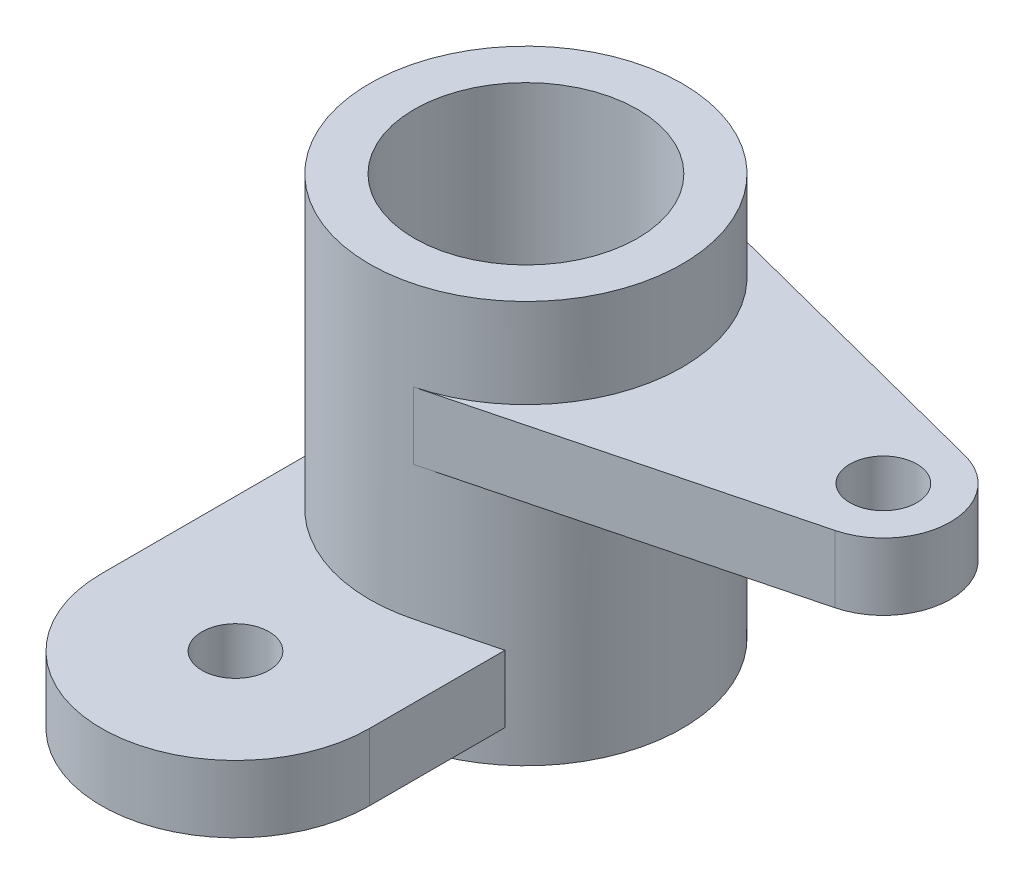
ISO-10303-21;
HEADER;
FILE_DESCRIPTION(('STEP AP214'),'2;1');
FILE_NAME('part.step','',(''),(''),'','','');
FILE_SCHEMA(('AUTOMOTIVE_DESIGN { 1 0 10303 214 1 1 1 1 }'));
ENDSEC;
DATA;
#1=APPLICATION_CONTEXT('core data for automotive mechanical design processes');
#2=APPLICATION_PROTOCOL_DEFINITION('international standard','automotive_design',2000,#1);
#3=PRODUCT_CONTEXT('',#1,'mechanical');
#4=PRODUCT('Part','Part','',(#3));
#5=PRODUCT_RELATED_PRODUCT_CATEGORY('part','',(#4));
#6=PRODUCT_DEFINITION_FORMATION('','',#4);
#7=PRODUCT_DEFINITION_CONTEXT('part definition',#1,'design');
#8=PRODUCT_DEFINITION('design','',#6,#7);
#9=PRODUCT_DEFINITION_SHAPE('','',#8);
#10=(LENGTH_UNIT() NAMED_UNIT(*) SI_UNIT(.MILLI.,.METRE.));
#11=(NAMED_UNIT(*) PLANE_ANGLE_UNIT() SI_UNIT($,.RADIAN.));
#12=(NAMED_UNIT(*) SI_UNIT($,.STERADIAN.) SOLID_ANGLE_UNIT());
#13=UNCERTAINTY_MEASURE_WITH_UNIT(LENGTH_MEASURE(1.E-05),#10,'distance_accuracy_value','');
#14=(GEOMETRIC_REPRESENTATION_CONTEXT(3) GLOBAL_UNCERTAINTY_ASSIGNED_CONTEXT((#13)) GLOBAL_UNIT_ASSIGNED_CONTEXT((#10,
#11,#12)) REPRESENTATION_CONTEXT('',''));
#15=CARTESIAN_POINT('',(0.,0.,0.));
#16=DIRECTION('',(0.,0.,1.));
#17=DIRECTION('',(1.,0.,0.));
#18=AXIS2_PLACEMENT_3D('',#15,#16,#17);
#19=CARTESIAN_POINT('',(0.,-90.,0.));
#20=DIRECTION('',(0.,1.,0.));
#21=DIRECTION('',(0.,0.,1.));
#22=AXIS2_PLACEMENT_3D('',#19,#20,#21);
#23=CYLINDRICAL_SURFACE('',#22,35.);
#24=CARTESIAN_POINT('',(0.,-90.,0.));
#25=DIRECTION('',(0.,1.,0.));
#26=DIRECTION('',(0.,0.,1.));
#27=AXIS2_PLACEMENT_3D('',#24,#25,#26);
#28=CIRCLE('',#27,35.);
#29=CARTESIAN_POINT('',(0.,-90.,35.));
#30=VERTEX_POINT('',#29);
#31=EDGE_CURVE('E11',#30,#30,#28,.T.);
#32=ORIENTED_EDGE('',*,*,#31,.T.);
#33=EDGE_LOOP('',(#32));
#34=FACE_BOUND('',#33,.T.);
#35=CARTESIAN_POINT('',(0.,0.,0.));
#36=DIRECTION('',(0.,1.,0.));
#37=DIRECTION('',(0.,0.,1.));
#38=AXIS2_PLACEMENT_3D('',#35,#36,#37);
#39=CIRCLE('',#38,35.);
#40=CARTESIAN_POINT('',(0.,0.,35.));
#41=VERTEX_POINT('',#40);
#42=EDGE_CURVE('E49',#41,#41,#39,.T.);
#43=ORIENTED_EDGE('',*,*,#42,.F.);
#44=EDGE_LOOP('',(#43));
#45=FACE_BOUND('',#44,.T.);
#46=DIRECTION('',(0.,1.,0.));
#47=VECTOR('',#46,1.);
#48=CARTESIAN_POINT('',(8.75000000000001,-35.,-33.8886042793149));
#49=LINE('',#48,#47);
#50=CARTESIAN_POINT('',(8.75000000000002,-35.,-33.8886042793149));
#51=VERTEX_POINT('',#50);
#52=CARTESIAN_POINT('',(8.75000000000002,-20.,-33.8886042793149));
#53=VERTEX_POINT('',#52);
#54=EDGE_CURVE('E231',#51,#53,#49,.T.);
#55=ORIENTED_EDGE('',*,*,#54,.F.);
#56=CARTESIAN_POINT('',(0.,-35.,0.));
#57=DIRECTION('',(0.,1.,0.));
#58=DIRECTION('',(0.,0.,1.));
#59=AXIS2_PLACEMENT_3D('',#56,#57,#58);
#60=CIRCLE('',#59,35.);
#61=CARTESIAN_POINT('',(8.75000000000001,-35.,33.8886042793149));
#62=VERTEX_POINT('',#61);
#63=EDGE_CURVE('E198',#62,#51,#60,.T.);
#64=ORIENTED_EDGE('',*,*,#63,.F.);
#65=DIRECTION('',(0.,1.,0.));
#66=VECTOR('',#65,1.);
#67=CARTESIAN_POINT('',(8.75000000000001,-35.,33.8886042793149));
#68=LINE('',#67,#66);
#69=CARTESIAN_POINT('',(8.75000000000001,-20.,33.8886042793149));
#70=VERTEX_POINT('',#69);
#71=EDGE_CURVE('E228',#62,#70,#68,.T.);
#72=ORIENTED_EDGE('',*,*,#71,.T.);
#73=CARTESIAN_POINT('',(0.,-20.,0.));
#74=DIRECTION('',(0.,1.,0.));
#75=DIRECTION('',(0.,0.,1.));
#76=AXIS2_PLACEMENT_3D('',#73,#74,#75);
#77=CIRCLE('',#76,35.);
#78=EDGE_CURVE('E218',#70,#53,#77,.T.);
#79=ORIENTED_EDGE('',*,*,#78,.T.);
#80=EDGE_LOOP('',(#55,#64,#72,#79));
#81=FACE_BOUND('',#80,.T.);
#82=DIRECTION('',(0.,1.,0.));
#83=VECTOR('',#82,1.);
#84=CARTESIAN_POINT('',(8.75000000000001,-80.,33.8886042793149));
#85=LINE('',#84,#83);
#86=CARTESIAN_POINT('',(8.75000000000001,-80.,33.8886042793149));
#87=VERTEX_POINT('',#86);
#88=CARTESIAN_POINT('',(8.75000000000001,-65.,33.8886042793149));
#89=VERTEX_POINT('',#88);
#90=EDGE_CURVE('E68',#87,#89,#85,.T.);
#91=ORIENTED_EDGE('',*,*,#90,.F.);
#92=CARTESIAN_POINT('',(0.,-80.,0.));
#93=DIRECTION('',(0.,1.,0.));
#94=DIRECTION('',(0.,0.,1.));
#95=AXIS2_PLACEMENT_3D('',#92,#93,#94);
#96=CIRCLE('',#95,35.);
#97=CARTESIAN_POINT('',(-35.,-80.,0.));
#98=VERTEX_POINT('',#97);
#99=EDGE_CURVE('E63',#98,#87,#96,.T.);
#100=ORIENTED_EDGE('',*,*,#99,.F.);
#101=DIRECTION('',(0.,1.,0.));
#102=VECTOR('',#101,1.);
#103=CARTESIAN_POINT('',(-35.,-80.,0.));
#104=LINE('',#103,#102);
#105=CARTESIAN_POINT('',(-35.,-65.,0.));
#106=VERTEX_POINT('',#105);
#107=EDGE_CURVE('E133',#98,#106,#104,.T.);
#108=ORIENTED_EDGE('',*,*,#107,.T.);
#109=CARTESIAN_POINT('',(0.,-65.,0.));
#110=DIRECTION('',(0.,1.,0.));
#111=DIRECTION('',(0.,0.,1.));
#112=AXIS2_PLACEMENT_3D('',#109,#110,#111);
#113=CIRCLE('',#112,35.);
#114=EDGE_CURVE('E172',#106,#89,#113,.T.);
#115=ORIENTED_EDGE('',*,*,#114,.T.);
#116=EDGE_LOOP('',(#91,#100,#108,#115));
#117=FACE_BOUND('',#116,.T.);
#118=ADVANCED_FACE('F45',(#34,#45,#81,#117),#23,.T.);
#119=CARTESIAN_POINT('',(0.,-90.,0.));
#120=DIRECTION('',(0.,1.,0.));
#121=DIRECTION('',(0.,0.,1.));
#122=AXIS2_PLACEMENT_3D('',#119,#120,#121);
#123=CYLINDRICAL_SURFACE('',#122,25.);
#124=CARTESIAN_POINT('',(0.,-90.,0.));
#125=DIRECTION('',(0.,1.,0.));
#126=DIRECTION('',(0.,0.,1.));
#127=AXIS2_PLACEMENT_3D('',#124,#125,#126);
#128=CIRCLE('',#127,25.);
#129=CARTESIAN_POINT('',(0.,-90.,25.));
#130=VERTEX_POINT('',#129);
#131=EDGE_CURVE('E55',#130,#130,#128,.T.);
#132=CARTESIAN_POINT('',(0.,0.,0.));
#133=DIRECTION('',(0.,1.,0.));
#134=DIRECTION('',(0.,0.,1.));
#135=AXIS2_PLACEMENT_3D('',#132,#133,#134);
#136=CIRCLE('',#135,25.);
#137=CARTESIAN_POINT('',(0.,0.,25.));
#138=VERTEX_POINT('',#137);
#139=EDGE_CURVE('E227',#138,#138,#136,.T.);
#140=CARTESIAN_POINT('',(0.,-90.,25.));
#141=CARTESIAN_POINT('',(0.,-89.0625,25.));
#142=CARTESIAN_POINT('',(0.,-88.125,25.));
#143=CARTESIAN_POINT('',(0.,-86.25,25.));
#144=CARTESIAN_POINT('',(0.,-85.3125,25.));
#145=CARTESIAN_POINT('',(0.,-83.4375,25.));
#146=CARTESIAN_POINT('',(0.,-82.5,25.));
#147=CARTESIAN_POINT('',(0.,-80.625,25.));
#148=CARTESIAN_POINT('',(0.,-79.6875,25.));
#149=CARTESIAN_POINT('',(0.,-77.8125,25.));
#150=CARTESIAN_POINT('',(0.,-76.875,25.));
#151=CARTESIAN_POINT('',(0.,-75.,25.));
#152=CARTESIAN_POINT('',(0.,-74.0625,25.));
#153=CARTESIAN_POINT('',(0.,-72.1875,25.));
#154=CARTESIAN_POINT('',(0.,-71.25,25.));
#155=CARTESIAN_POINT('',(0.,-69.375,25.));
#156=CARTESIAN_POINT('',(0.,-68.4375,25.));
#157=CARTESIAN_POINT('',(0.,-66.5625,25.));
#158=CARTESIAN_POINT('',(0.,-65.625,25.));
#159=CARTESIAN_POINT('',(0.,-63.75,25.));
#160=CARTESIAN_POINT('',(0.,-62.8125,25.));
#161=CARTESIAN_POINT('',(0.,-60.9375,25.));
#162=CARTESIAN_POINT('',(0.,-60.,25.));
#163=CARTESIAN_POINT('',(0.,-58.125,25.));
#164=CARTESIAN_POINT('',(0.,-57.1875,25.));
#165=CARTESIAN_POINT('',(0.,-55.3125,25.));
#166=CARTESIAN_POINT('',(0.,-54.375,25.));
#167=CARTESIAN_POINT('',(0.,-52.5,25.));
#168=CARTESIAN_POINT('',(0.,-51.5625,25.));
#169=CARTESIAN_POINT('',(0.,-49.6875,25.));
#170=CARTESIAN_POINT('',(0.,-48.75,25.));
#171=CARTESIAN_POINT('',(0.,-46.875,25.));
#172=CARTESIAN_POINT('',(0.,-45.9375,25.));
#173=CARTESIAN_POINT('',(0.,-44.0625,25.));
#174=CARTESIAN_POINT('',(0.,-43.125,25.));
#175=CARTESIAN_POINT('',(0.,-41.25,25.));
#176=CARTESIAN_POINT('',(0.,-40.3125,25.));
#177=CARTESIAN_POINT('',(0.,-38.4375,25.));
#178=CARTESIAN_POINT('',(0.,-37.5,25.));
#179=CARTESIAN_POINT('',(0.,-35.625,25.));
#180=CARTESIAN_POINT('',(0.,-34.6875,25.));
#181=CARTESIAN_POINT('',(0.,-32.8125,25.));
#182=CARTESIAN_POINT('',(0.,-31.875,25.));
#183=CARTESIAN_POINT('',(0.,-30.,25.));
#184=CARTESIAN_POINT('',(0.,-29.0625,25.));
#185=CARTESIAN_POINT('',(0.,-27.1875,25.));
#186=CARTESIAN_POINT('',(0.,-26.25,25.));
#187=CARTESIAN_POINT('',(0.,-24.375,25.));
#188=CARTESIAN_POINT('',(0.,-23.4375,25.));
#189=CARTESIAN_POINT('',(0.,-21.5625,25.));
#190=CARTESIAN_POINT('',(0.,-20.625,25.));
#191=CARTESIAN_POINT('',(0.,-18.75,25.));
#192=CARTESIAN_POINT('',(0.,-17.8125,25.));
#193=CARTESIAN_POINT('',(0.,-15.9375,25.));
#194=CARTESIAN_POINT('',(0.,-15.,25.));
#195=CARTESIAN_POINT('',(0.,-13.125,25.));
#196=CARTESIAN_POINT('',(0.,-12.1875,25.));
#197=CARTESIAN_POINT('',(0.,-10.3125,25.));
#198=CARTESIAN_POINT('',(0.,-9.37500000000001,25.));
#199=CARTESIAN_POINT('',(0.,-7.50000000000002,25.));
#200=CARTESIAN_POINT('',(0.,-6.56250000000002,25.));
#201=CARTESIAN_POINT('',(0.,-4.68750000000002,25.));
#202=CARTESIAN_POINT('',(0.,-3.75000000000001,25.));
#203=CARTESIAN_POINT('',(0.,-1.87500000000001,25.));
#204=CARTESIAN_POINT('',(0.,-0.937500000000014,25.));
#205=CARTESIAN_POINT('',(0.,0.,25.));
#206=B_SPLINE_CURVE_WITH_KNOTS('',3,(#140,#141,#142,#143,#144,#145,#146,#147,#148,#149,#150,
#151,#152,#153,#154,#155,#156,#157,#158,#159,#160,#161,#162,#163,#164,#165,#166,#167,#168,#169,
#170,#171,#172,#173,#174,#175,#176,#177,#178,#179,#180,#181,#182,#183,#184,#185,#186,#187,#188,
#189,#190,#191,#192,#193,#194,#195,#196,#197,#198,#199,#200,#201,#202,#203,#204,#205),
.UNSPECIFIED.,.F.,.F.,(4,2,2,2,2,2,2,2,2,2,2,2,2,2,2,2,2,2,2,2,2,2,2,2,2,2,2,2,2,2,2,2,4),(0.,
2.81250000000001,5.62500000000001,8.4375,11.25,14.0625,16.875,19.6875,22.5,25.3125,28.125,
30.9375,33.75,36.5625,39.375,42.1875,45.,47.8125,50.625,53.4375,56.25,59.0625,61.875,64.6875,
67.5,70.3125,73.125,75.9375,78.75,81.5625,84.375,87.1875,90.),.UNSPECIFIED.);
#207=EDGE_CURVE('BSEAM47',#130,#138,#206,.T.);
#208=ORIENTED_EDGE('',*,*,#131,.F.);
#209=ORIENTED_EDGE('',*,*,#139,.T.);
#210=ORIENTED_EDGE('',*,*,#207,.T.);
#211=ORIENTED_EDGE('',*,*,#207,.F.);
#212=EDGE_LOOP('',(#208,#210,#209,#211));
#213=FACE_BOUND('',#212,.T.);
#214=ADVANCED_FACE('F47',(#213),#123,.F.);
#215=CARTESIAN_POINT('',(0.,-90.,0.));
#216=DIRECTION('',(0.,1.,0.));
#217=DIRECTION('',(0.,0.,1.));
#218=AXIS2_PLACEMENT_3D('',#215,#216,#217);
#219=PLANE('',#218);
#220=ORIENTED_EDGE('',*,*,#131,.T.);
#221=EDGE_LOOP('',(#220));
#222=FACE_BOUND('',#221,.T.);
#223=ORIENTED_EDGE('',*,*,#31,.F.);
#224=EDGE_LOOP('',(#223));
#225=FACE_BOUND('',#224,.T.);
#226=ADVANCED_FACE('F294',(#222,#225),#219,.F.);
#227=CARTESIAN_POINT('',(0.,0.,0.));
#228=DIRECTION('',(0.,1.,0.));
#229=DIRECTION('',(0.,0.,1.));
#230=AXIS2_PLACEMENT_3D('',#227,#228,#229);
#231=PLANE('',#230);
#232=ORIENTED_EDGE('',*,*,#139,.F.);
#233=EDGE_LOOP('',(#232));
#234=FACE_BOUND('',#233,.T.);
#235=ORIENTED_EDGE('',*,*,#42,.T.);
#236=EDGE_LOOP('',(#235));
#237=FACE_BOUND('',#236,.T.);
#238=ADVANCED_FACE('F247',(#234,#237),#231,.T.);
#239=CARTESIAN_POINT('',(80.,-35.,0.));
#240=DIRECTION('',(0.,1.,0.));
#241=DIRECTION('',(0.,0.,1.));
#242=AXIS2_PLACEMENT_3D('',#239,#240,#241);
#243=CYLINDRICAL_SURFACE('',#242,15.);
#244=CARTESIAN_POINT('',(80.,-20.,0.));
#245=DIRECTION('',(0.,1.,0.));
#246=DIRECTION('',(0.,0.,1.));
#247=AXIS2_PLACEMENT_3D('',#244,#245,#246);
#248=CIRCLE('',#247,15.);
#249=CARTESIAN_POINT('',(83.75,-20.,14.5236875482778));
#250=VERTEX_POINT('',#249);
#251=CARTESIAN_POINT('',(83.75,-20.,-14.5236875482778));
#252=VERTEX_POINT('',#251);
#253=EDGE_CURVE('E210',#250,#252,#248,.T.);
#254=ORIENTED_EDGE('',*,*,#253,.F.);
#255=DIRECTION('',(0.,1.,0.));
#256=VECTOR('',#255,1.);
#257=CARTESIAN_POINT('',(83.75,-35.,14.5236875482778));
#258=LINE('',#257,#256);
#259=CARTESIAN_POINT('',(83.75,-35.,14.5236875482778));
#260=VERTEX_POINT('',#259);
#261=EDGE_CURVE('E224',#260,#250,#258,.T.);
#262=ORIENTED_EDGE('',*,*,#261,.F.);
#263=CARTESIAN_POINT('',(80.,-35.,0.));
#264=DIRECTION('',(0.,1.,0.));
#265=DIRECTION('',(0.,0.,1.));
#266=AXIS2_PLACEMENT_3D('',#263,#264,#265);
#267=CIRCLE('',#266,15.);
#268=CARTESIAN_POINT('',(83.75,-35.,-14.5236875482778));
#269=VERTEX_POINT('',#268);
#270=EDGE_CURVE('E189',#260,#269,#267,.T.);
#271=ORIENTED_EDGE('',*,*,#270,.T.);
#272=DIRECTION('',(0.,1.,0.));
#273=VECTOR('',#272,1.);
#274=CARTESIAN_POINT('',(83.75,-35.,-14.5236875482778));
#275=LINE('',#274,#273);
#276=EDGE_CURVE('E206',#269,#252,#275,.T.);
#277=ORIENTED_EDGE('',*,*,#276,.T.);
#278=EDGE_LOOP('',(#254,#262,#271,#277));
#279=FACE_BOUND('',#278,.T.);
#280=ADVANCED_FACE('F264',(#279),#243,.T.);
#281=CARTESIAN_POINT('',(8.75000000000001,-35.,33.8886042793149));
#282=DIRECTION('',(-0.25,0.,-0.968245836551854));
#283=DIRECTION('',(-0.968245836551854,0.,0.25));
#284=AXIS2_PLACEMENT_3D('',#281,#282,#283);
#285=PLANE('',#284);
#286=DIRECTION('',(-0.968245836551854,0.,0.25));
#287=VECTOR('',#286,1.);
#288=CARTESIAN_POINT('',(8.75000000000001,-20.,33.8886042793149));
#289=LINE('',#288,#287);
#290=EDGE_CURVE('E190',#250,#70,#289,.T.);
#291=ORIENTED_EDGE('',*,*,#290,.T.);
#292=ORIENTED_EDGE('',*,*,#71,.F.);
#293=DIRECTION('',(-0.968245836551854,0.,0.25));
#294=VECTOR('',#293,1.);
#295=CARTESIAN_POINT('',(8.75000000000001,-35.,33.8886042793149));
#296=LINE('',#295,#294);
#297=EDGE_CURVE('E202',#260,#62,#296,.T.);
#298=ORIENTED_EDGE('',*,*,#297,.F.);
#299=ORIENTED_EDGE('',*,*,#261,.T.);
#300=EDGE_LOOP('',(#291,#292,#298,#299));
#301=FACE_BOUND('',#300,.T.);
#302=ADVANCED_FACE('F267',(#301),#285,.F.);
#303=CARTESIAN_POINT('',(80.,-35.,0.));
#304=DIRECTION('',(0.,1.,0.));
#305=DIRECTION('',(0.,0.,1.));
#306=AXIS2_PLACEMENT_3D('',#303,#304,#305);
#307=CYLINDRICAL_SURFACE('',#306,7.50000000000001);
#308=CARTESIAN_POINT('',(80.,-35.,0.));
#309=DIRECTION('',(0.,1.,0.));
#310=DIRECTION('',(0.,0.,1.));
#311=AXIS2_PLACEMENT_3D('',#308,#309,#310);
#312=CIRCLE('',#311,7.50000000000001);
#313=CARTESIAN_POINT('',(80.,-35.,7.50000000000001));
#314=VERTEX_POINT('',#313);
#315=EDGE_CURVE('E185',#314,#314,#312,.T.);
#316=ORIENTED_EDGE('',*,*,#315,.F.);
#317=EDGE_LOOP('',(#316));
#318=FACE_BOUND('',#317,.T.);
#319=CARTESIAN_POINT('',(80.,-20.,0.));
#320=DIRECTION('',(0.,1.,0.));
#321=DIRECTION('',(0.,0.,1.));
#322=AXIS2_PLACEMENT_3D('',#319,#320,#321);
#323=CIRCLE('',#322,7.50000000000001);
#324=CARTESIAN_POINT('',(80.,-20.,7.50000000000001));
#325=VERTEX_POINT('',#324);
#326=EDGE_CURVE('E177',#325,#325,#323,.T.);
#327=ORIENTED_EDGE('',*,*,#326,.T.);
#328=EDGE_LOOP('',(#327));
#329=FACE_BOUND('',#328,.T.);
#330=ADVANCED_FACE('F286',(#318,#329),#307,.F.);
#331=CARTESIAN_POINT('',(8.75000000000002,-35.,-33.8886042793149));
#332=DIRECTION('',(0.25,0.,-0.968245836551854));
#333=DIRECTION('',(-0.968245836551854,0.,-0.25));
#334=AXIS2_PLACEMENT_3D('',#331,#332,#333);
#335=PLANE('',#334);
#336=DIRECTION('',(-0.968245836551854,0.,-0.25));
#337=VECTOR('',#336,1.);
#338=CARTESIAN_POINT('',(8.75000000000002,-20.,-33.8886042793149));
#339=LINE('',#338,#337);
#340=EDGE_CURVE('E214',#252,#53,#339,.T.);
#341=ORIENTED_EDGE('',*,*,#340,.F.);
#342=ORIENTED_EDGE('',*,*,#276,.F.);
#343=DIRECTION('',(-0.968245836551854,0.,-0.25));
#344=VECTOR('',#343,1.);
#345=CARTESIAN_POINT('',(8.75000000000002,-35.,-33.8886042793149));
#346=LINE('',#345,#344);
#347=EDGE_CURVE('E194',#269,#51,#346,.T.);
#348=ORIENTED_EDGE('',*,*,#347,.T.);
#349=ORIENTED_EDGE('',*,*,#54,.T.);
#350=EDGE_LOOP('',(#341,#342,#348,#349));
#351=FACE_BOUND('',#350,.T.);
#352=ADVANCED_FACE('F261',(#351),#335,.T.);
#353=CARTESIAN_POINT('',(0.,-35.,0.));
#354=DIRECTION('',(0.,1.,0.));
#355=DIRECTION('',(0.,0.,1.));
#356=AXIS2_PLACEMENT_3D('',#353,#354,#355);
#357=PLANE('',#356);
#358=ORIENTED_EDGE('',*,*,#315,.T.);
#359=EDGE_LOOP('',(#358));
#360=FACE_BOUND('',#359,.T.);
#361=ORIENTED_EDGE('',*,*,#270,.F.);
#362=ORIENTED_EDGE('',*,*,#297,.T.);
#363=ORIENTED_EDGE('',*,*,#63,.T.);
#364=ORIENTED_EDGE('',*,*,#347,.F.);
#365=EDGE_LOOP('',(#361,#362,#363,#364));
#366=FACE_BOUND('',#365,.T.);
#367=ADVANCED_FACE('F258',(#360,#366),#357,.F.);
#368=CARTESIAN_POINT('',(0.,-20.,0.));
#369=DIRECTION('',(0.,1.,0.));
#370=DIRECTION('',(0.,0.,1.));
#371=AXIS2_PLACEMENT_3D('',#368,#369,#370);
#372=PLANE('',#371);
#373=ORIENTED_EDGE('',*,*,#326,.F.);
#374=EDGE_LOOP('',(#373));
#375=FACE_BOUND('',#374,.T.);
#376=ORIENTED_EDGE('',*,*,#253,.T.);
#377=ORIENTED_EDGE('',*,*,#340,.T.);
#378=ORIENTED_EDGE('',*,*,#78,.F.);
#379=ORIENTED_EDGE('',*,*,#290,.F.);
#380=EDGE_LOOP('',(#376,#377,#378,#379));
#381=FACE_BOUND('',#380,.T.);
#382=ADVANCED_FACE('F269',(#375,#381),#372,.T.);
#383=CARTESIAN_POINT('',(-35.,-80.,0.));
#384=DIRECTION('',(1.,0.,0.));
#385=DIRECTION('',(0.,0.,-1.));
#386=AXIS2_PLACEMENT_3D('',#383,#384,#385);
#387=PLANE('',#386);
#388=DIRECTION('',(0.,0.,-1.));
#389=VECTOR('',#388,1.);
#390=CARTESIAN_POINT('',(-35.,-65.,0.));
#391=LINE('',#390,#389);
#392=CARTESIAN_POINT('',(-35.,-65.,60.));
#393=VERTEX_POINT('',#392);
#394=EDGE_CURVE('E159',#393,#106,#391,.T.);
#395=ORIENTED_EDGE('',*,*,#394,.T.);
#396=ORIENTED_EDGE('',*,*,#107,.F.);
#397=DIRECTION('',(0.,0.,-1.));
#398=VECTOR('',#397,1.);
#399=CARTESIAN_POINT('',(-35.,-80.,0.));
#400=LINE('',#399,#398);
#401=CARTESIAN_POINT('',(-35.,-80.,60.));
#402=VERTEX_POINT('',#401);
#403=EDGE_CURVE('E131',#402,#98,#400,.T.);
#404=ORIENTED_EDGE('',*,*,#403,.F.);
#405=DIRECTION('',(0.,1.,0.));
#406=VECTOR('',#405,1.);
#407=CARTESIAN_POINT('',(-35.,-80.,60.));
#408=LINE('',#407,#406);
#409=EDGE_CURVE('E117',#402,#393,#408,.T.);
#410=ORIENTED_EDGE('',*,*,#409,.T.);
#411=EDGE_LOOP('',(#395,#396,#404,#410));
#412=FACE_BOUND('',#411,.T.);
#413=ADVANCED_FACE('F132',(#412),#387,.F.);
#414=CARTESIAN_POINT('',(8.75000000000001,-80.,33.8886042793149));
#415=DIRECTION('',(-0.25,0.,-0.968245836551854));
#416=DIRECTION('',(-0.968245836551854,0.,0.25));
#417=AXIS2_PLACEMENT_3D('',#414,#415,#416);
#418=PLANE('',#417);
#419=DIRECTION('',(-0.968245836551854,0.,0.25));
#420=VECTOR('',#419,1.);
#421=CARTESIAN_POINT('',(8.75000000000001,-65.,33.8886042793149));
#422=LINE('',#421,#420);
#423=CARTESIAN_POINT('',(25.,-65.,29.6928723209235));
#424=VERTEX_POINT('',#423);
#425=EDGE_CURVE('E168',#424,#89,#422,.T.);
#426=ORIENTED_EDGE('',*,*,#425,.F.);
#427=DIRECTION('',(0.,1.,0.));
#428=VECTOR('',#427,1.);
#429=CARTESIAN_POINT('',(25.,-80.,29.6928723209235));
#430=LINE('',#429,#428);
#431=CARTESIAN_POINT('',(25.,-80.,29.6928723209235));
#432=VERTEX_POINT('',#431);
#433=EDGE_CURVE('E180',#432,#424,#430,.T.);
#434=ORIENTED_EDGE('',*,*,#433,.F.);
#435=DIRECTION('',(-0.968245836551854,0.,0.25));
#436=VECTOR('',#435,1.);
#437=CARTESIAN_POINT('',(8.75000000000001,-80.,33.8886042793149));
#438=LINE('',#437,#436);
#439=EDGE_CURVE('E146',#432,#87,#438,.T.);
#440=ORIENTED_EDGE('',*,*,#439,.T.);
#441=ORIENTED_EDGE('',*,*,#90,.T.);
#442=EDGE_LOOP('',(#426,#434,#440,#441));
#443=FACE_BOUND('',#442,.T.);
#444=ADVANCED_FACE('F277',(#443),#418,.T.);
#445=CARTESIAN_POINT('',(25.,-80.,0.));
#446=DIRECTION('',(1.,0.,0.));
#447=DIRECTION('',(0.,0.,-1.));
#448=AXIS2_PLACEMENT_3D('',#445,#446,#447);
#449=PLANE('',#448);
#450=DIRECTION('',(0.,0.,-1.));
#451=VECTOR('',#450,1.);
#452=CARTESIAN_POINT('',(25.,-65.,0.));
#453=LINE('',#452,#451);
#454=CARTESIAN_POINT('',(25.,-65.,60.));
#455=VERTEX_POINT('',#454);
#456=EDGE_CURVE('E164',#455,#424,#453,.T.);
#457=ORIENTED_EDGE('',*,*,#456,.F.);
#458=DIRECTION('',(0.,1.,0.));
#459=VECTOR('',#458,1.);
#460=CARTESIAN_POINT('',(25.,-80.,60.));
#461=LINE('',#460,#459);
#462=CARTESIAN_POINT('',(25.,-80.,60.));
#463=VERTEX_POINT('',#462);
#464=EDGE_CURVE('E128',#463,#455,#461,.T.);
#465=ORIENTED_EDGE('',*,*,#464,.F.);
#466=DIRECTION('',(0.,0.,-1.));
#467=VECTOR('',#466,1.);
#468=CARTESIAN_POINT('',(25.,-80.,0.));
#469=LINE('',#468,#467);
#470=EDGE_CURVE('E142',#463,#432,#469,.T.);
#471=ORIENTED_EDGE('',*,*,#470,.T.);
#472=ORIENTED_EDGE('',*,*,#433,.T.);
#473=EDGE_LOOP('',(#457,#465,#471,#472));
#474=FACE_BOUND('',#473,.T.);
#475=ADVANCED_FACE('F355',(#474),#449,.T.);
#476=CARTESIAN_POINT('',(-5.,-80.,60.));
#477=DIRECTION('',(0.,1.,0.));
#478=DIRECTION('',(0.,0.,1.));
#479=AXIS2_PLACEMENT_3D('',#476,#477,#478);
#480=CYLINDRICAL_SURFACE('',#479,7.5);
#481=CARTESIAN_POINT('',(-5.,-80.,60.));
#482=DIRECTION('',(0.,1.,0.));
#483=DIRECTION('',(0.,0.,1.));
#484=AXIS2_PLACEMENT_3D('',#481,#482,#483);
#485=CIRCLE('',#484,7.5);
#486=CARTESIAN_POINT('',(-5.,-80.,67.5));
#487=VERTEX_POINT('',#486);
#488=EDGE_CURVE('E136',#487,#487,#485,.T.);
#489=ORIENTED_EDGE('',*,*,#488,.F.);
#490=EDGE_LOOP('',(#489));
#491=FACE_BOUND('',#490,.T.);
#492=CARTESIAN_POINT('',(-5.,-65.,60.));
#493=DIRECTION('',(0.,1.,0.));
#494=DIRECTION('',(0.,0.,1.));
#495=AXIS2_PLACEMENT_3D('',#492,#493,#494);
#496=CIRCLE('',#495,7.5);
#497=CARTESIAN_POINT('',(-5.,-65.,67.5));
#498=VERTEX_POINT('',#497);
#499=EDGE_CURVE('E155',#498,#498,#496,.T.);
#500=ORIENTED_EDGE('',*,*,#499,.T.);
#501=EDGE_LOOP('',(#500));
#502=FACE_BOUND('',#501,.T.);
#503=ADVANCED_FACE('F366',(#491,#502),#480,.F.);
#504=CARTESIAN_POINT('',(-5.,-80.,60.));
#505=DIRECTION('',(0.,1.,0.));
#506=DIRECTION('',(0.,0.,1.));
#507=AXIS2_PLACEMENT_3D('',#504,#505,#506);
#508=CYLINDRICAL_SURFACE('',#507,30.);
#509=CARTESIAN_POINT('',(-5.,-65.,60.));
#510=DIRECTION('',(0.,1.,0.));
#511=DIRECTION('',(0.,0.,1.));
#512=AXIS2_PLACEMENT_3D('',#509,#510,#511);
#513=CIRCLE('',#512,30.);
#514=EDGE_CURVE('E123',#393,#455,#513,.T.);
#515=ORIENTED_EDGE('',*,*,#514,.F.);
#516=ORIENTED_EDGE('',*,*,#409,.F.);
#517=CARTESIAN_POINT('',(-5.,-80.,60.));
#518=DIRECTION('',(0.,1.,0.));
#519=DIRECTION('',(0.,0.,1.));
#520=AXIS2_PLACEMENT_3D('',#517,#518,#519);
#521=CIRCLE('',#520,30.);
#522=EDGE_CURVE('E121',#402,#463,#521,.T.);
#523=ORIENTED_EDGE('',*,*,#522,.T.);
#524=ORIENTED_EDGE('',*,*,#464,.T.);
#525=EDGE_LOOP('',(#515,#516,#523,#524));
#526=FACE_BOUND('',#525,.T.);
#527=ADVANCED_FACE('F119',(#526),#508,.T.);
#528=CARTESIAN_POINT('',(0.,-80.,0.));
#529=DIRECTION('',(0.,1.,0.));
#530=DIRECTION('',(0.,0.,1.));
#531=AXIS2_PLACEMENT_3D('',#528,#529,#530);
#532=PLANE('',#531);
#533=ORIENTED_EDGE('',*,*,#488,.T.);
#534=EDGE_LOOP('',(#533));
#535=FACE_BOUND('',#534,.T.);
#536=ORIENTED_EDGE('',*,*,#403,.T.);
#537=ORIENTED_EDGE('',*,*,#99,.T.);
#538=ORIENTED_EDGE('',*,*,#439,.F.);
#539=ORIENTED_EDGE('',*,*,#470,.F.);
#540=ORIENTED_EDGE('',*,*,#522,.F.);
#541=EDGE_LOOP('',(#536,#537,#538,#539,#540));
#542=FACE_BOUND('',#541,.T.);
#543=ADVANCED_FACE('F139',(#535,#542),#532,.F.);
#544=CARTESIAN_POINT('',(0.,-65.,0.));
#545=DIRECTION('',(0.,1.,0.));
#546=DIRECTION('',(0.,0.,1.));
#547=AXIS2_PLACEMENT_3D('',#544,#545,#546);
#548=PLANE('',#547);
#549=ORIENTED_EDGE('',*,*,#499,.F.);
#550=EDGE_LOOP('',(#549));
#551=FACE_BOUND('',#550,.T.);
#552=ORIENTED_EDGE('',*,*,#394,.F.);
#553=ORIENTED_EDGE('',*,*,#514,.T.);
#554=ORIENTED_EDGE('',*,*,#456,.T.);
#555=ORIENTED_EDGE('',*,*,#425,.T.);
#556=ORIENTED_EDGE('',*,*,#114,.F.);
#557=EDGE_LOOP('',(#552,#553,#554,#555,#556));
#558=FACE_BOUND('',#557,.T.);
#559=ADVANCED_FACE('F395',(#551,#558),#548,.T.);
#560=CLOSED_SHELL('',(#118,#214,#226,#238,#280,#302,#330,#352,#367,#382,#413,#444,#475,#503,
#527,#543,#559));
#561=MANIFOLD_SOLID_BREP('B2',#560);
#562=ADVANCED_BREP_SHAPE_REPRESENTATION('',(#18,#561),#14);
#563=SHAPE_DEFINITION_REPRESENTATION(#9,#562);
ENDSEC;
END-ISO-10303-21;
